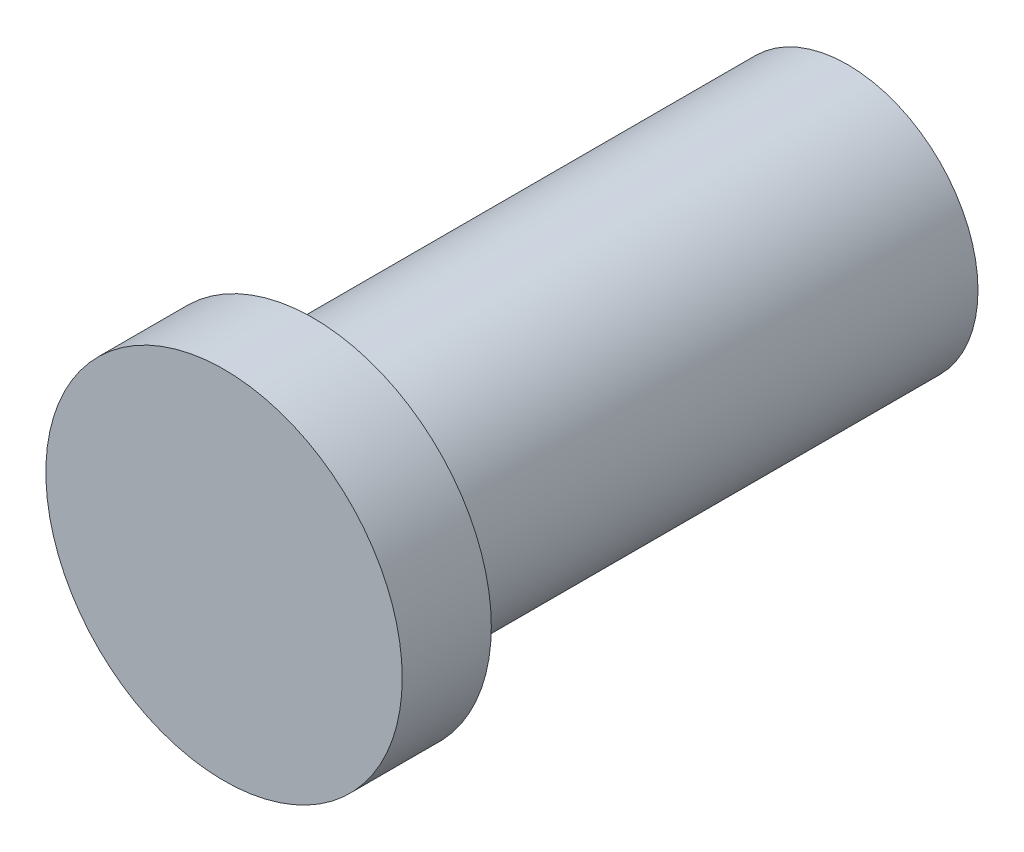
ISO-10303-21;
HEADER;
FILE_DESCRIPTION(('STEP AP214'),'2;1');
FILE_NAME('part.step','',(''),(''),'','','');
FILE_SCHEMA(('AUTOMOTIVE_DESIGN { 1 0 10303 214 1 1 1 1 }'));
ENDSEC;
DATA;
#1=APPLICATION_CONTEXT('core data for automotive mechanical design processes');
#2=APPLICATION_PROTOCOL_DEFINITION('international standard','automotive_design',2000,#1);
#3=PRODUCT_CONTEXT('',#1,'mechanical');
#4=PRODUCT('Part','Part','',(#3));
#5=PRODUCT_RELATED_PRODUCT_CATEGORY('part','',(#4));
#6=PRODUCT_DEFINITION_FORMATION('','',#4);
#7=PRODUCT_DEFINITION_CONTEXT('part definition',#1,'design');
#8=PRODUCT_DEFINITION('design','',#6,#7);
#9=PRODUCT_DEFINITION_SHAPE('','',#8);
#10=(LENGTH_UNIT() NAMED_UNIT(*) SI_UNIT(.MILLI.,.METRE.));
#11=(NAMED_UNIT(*) PLANE_ANGLE_UNIT() SI_UNIT($,.RADIAN.));
#12=(NAMED_UNIT(*) SI_UNIT($,.STERADIAN.) SOLID_ANGLE_UNIT());
#13=UNCERTAINTY_MEASURE_WITH_UNIT(LENGTH_MEASURE(1.E-05),#10,'distance_accuracy_value','');
#14=(GEOMETRIC_REPRESENTATION_CONTEXT(3) GLOBAL_UNCERTAINTY_ASSIGNED_CONTEXT((#13)) GLOBAL_UNIT_ASSIGNED_CONTEXT((#10,
#11,#12)) REPRESENTATION_CONTEXT('',''));
#15=CARTESIAN_POINT('',(0.,0.,0.));
#16=DIRECTION('',(0.,0.,1.));
#17=DIRECTION('',(1.,0.,0.));
#18=AXIS2_PLACEMENT_3D('',#15,#16,#17);
#19=CARTESIAN_POINT('',(-7.59718985582772,3.91897689768977,12.));
#20=DIRECTION('',(0.,0.,-1.));
#21=DIRECTION('',(-1.,0.,0.));
#22=AXIS2_PLACEMENT_3D('',#19,#20,#21);
#23=CYLINDRICAL_SURFACE('',#22,2.925);
#24=CARTESIAN_POINT('',(-7.59718985582772,3.91897689768977,12.));
#25=DIRECTION('',(0.,0.,1.));
#26=DIRECTION('',(1.,0.,0.));
#27=AXIS2_PLACEMENT_3D('',#24,#25,#26);
#28=CIRCLE('',#27,2.925);
#29=CARTESIAN_POINT('',(-4.67218985582772,3.91897689768977,12.));
#30=VERTEX_POINT('',#29);
#31=EDGE_CURVE('E10',#30,#30,#28,.T.);
#32=ORIENTED_EDGE('',*,*,#31,.F.);
#33=EDGE_LOOP('',(#32));
#34=FACE_BOUND('',#33,.T.);
#35=CARTESIAN_POINT('',(-7.59718985582772,3.91897689768977,0.));
#36=DIRECTION('',(0.,0.,1.));
#37=DIRECTION('',(1.,0.,0.));
#38=AXIS2_PLACEMENT_3D('',#35,#36,#37);
#39=CIRCLE('',#38,2.925);
#40=CARTESIAN_POINT('',(-4.67218985582772,3.91897689768977,0.));
#41=VERTEX_POINT('',#40);
#42=EDGE_CURVE('E34',#41,#41,#39,.T.);
#43=ORIENTED_EDGE('',*,*,#42,.T.);
#44=EDGE_LOOP('',(#43));
#45=FACE_BOUND('',#44,.T.);
#46=ADVANCED_FACE('F31',(#34,#45),#23,.T.);
#47=CARTESIAN_POINT('',(-7.59718985582772,3.91897689768977,0.));
#48=DIRECTION('',(0.,0.,1.));
#49=DIRECTION('',(1.,0.,0.));
#50=AXIS2_PLACEMENT_3D('',#47,#48,#49);
#51=PLANE('',#50);
#52=ORIENTED_EDGE('',*,*,#42,.F.);
#53=EDGE_LOOP('',(#52));
#54=FACE_BOUND('',#53,.T.);
#55=ADVANCED_FACE('F54',(#54),#51,.F.);
#56=CARTESIAN_POINT('',(-7.59718985582772,3.91897689768977,14.));
#57=DIRECTION('',(0.,0.,-1.));
#58=DIRECTION('',(-1.,0.,0.));
#59=AXIS2_PLACEMENT_3D('',#56,#57,#58);
#60=CYLINDRICAL_SURFACE('',#59,4.);
#61=CARTESIAN_POINT('',(-7.59718985582772,3.91897689768977,14.));
#62=DIRECTION('',(0.,0.,1.));
#63=DIRECTION('',(1.,0.,0.));
#64=AXIS2_PLACEMENT_3D('',#61,#62,#63);
#65=CIRCLE('',#64,4.);
#66=CARTESIAN_POINT('',(-3.59718985582772,3.91897689768977,14.));
#67=VERTEX_POINT('',#66);
#68=EDGE_CURVE('E41',#67,#67,#65,.T.);
#69=ORIENTED_EDGE('',*,*,#68,.F.);
#70=EDGE_LOOP('',(#69));
#71=FACE_BOUND('',#70,.T.);
#72=CARTESIAN_POINT('',(-7.59718985582772,3.91897689768977,12.));
#73=DIRECTION('',(0.,0.,1.));
#74=DIRECTION('',(1.,0.,0.));
#75=AXIS2_PLACEMENT_3D('',#72,#73,#74);
#76=CIRCLE('',#75,4.);
#77=CARTESIAN_POINT('',(-3.59718985582772,3.91897689768977,12.));
#78=VERTEX_POINT('',#77);
#79=EDGE_CURVE('E43',#78,#78,#76,.T.);
#80=ORIENTED_EDGE('',*,*,#79,.T.);
#81=EDGE_LOOP('',(#80));
#82=FACE_BOUND('',#81,.T.);
#83=ADVANCED_FACE('F51',(#71,#82),#60,.T.);
#84=CARTESIAN_POINT('',(-7.59718985582772,3.91897689768977,14.));
#85=DIRECTION('',(0.,0.,1.));
#86=DIRECTION('',(1.,0.,0.));
#87=AXIS2_PLACEMENT_3D('',#84,#85,#86);
#88=PLANE('',#87);
#89=ORIENTED_EDGE('',*,*,#68,.T.);
#90=EDGE_LOOP('',(#89));
#91=FACE_BOUND('',#90,.T.);
#92=ADVANCED_FACE('F49',(#91),#88,.T.);
#93=CARTESIAN_POINT('',(-7.59718985582772,3.91897689768977,12.));
#94=DIRECTION('',(0.,0.,1.));
#95=DIRECTION('',(1.,0.,0.));
#96=AXIS2_PLACEMENT_3D('',#93,#94,#95);
#97=PLANE('',#96);
#98=ORIENTED_EDGE('',*,*,#31,.T.);
#99=EDGE_LOOP('',(#98));
#100=FACE_BOUND('',#99,.T.);
#101=ORIENTED_EDGE('',*,*,#79,.F.);
#102=EDGE_LOOP('',(#101));
#103=FACE_BOUND('',#102,.T.);
#104=ADVANCED_FACE('F58',(#100,#103),#97,.F.);
#105=CLOSED_SHELL('',(#46,#55,#83,#92,#104));
#106=MANIFOLD_SOLID_BREP('B2',#105);
#107=ADVANCED_BREP_SHAPE_REPRESENTATION('',(#18,#106),#14);
#108=SHAPE_DEFINITION_REPRESENTATION(#9,#107);
ENDSEC;
END-ISO-10303-21;
